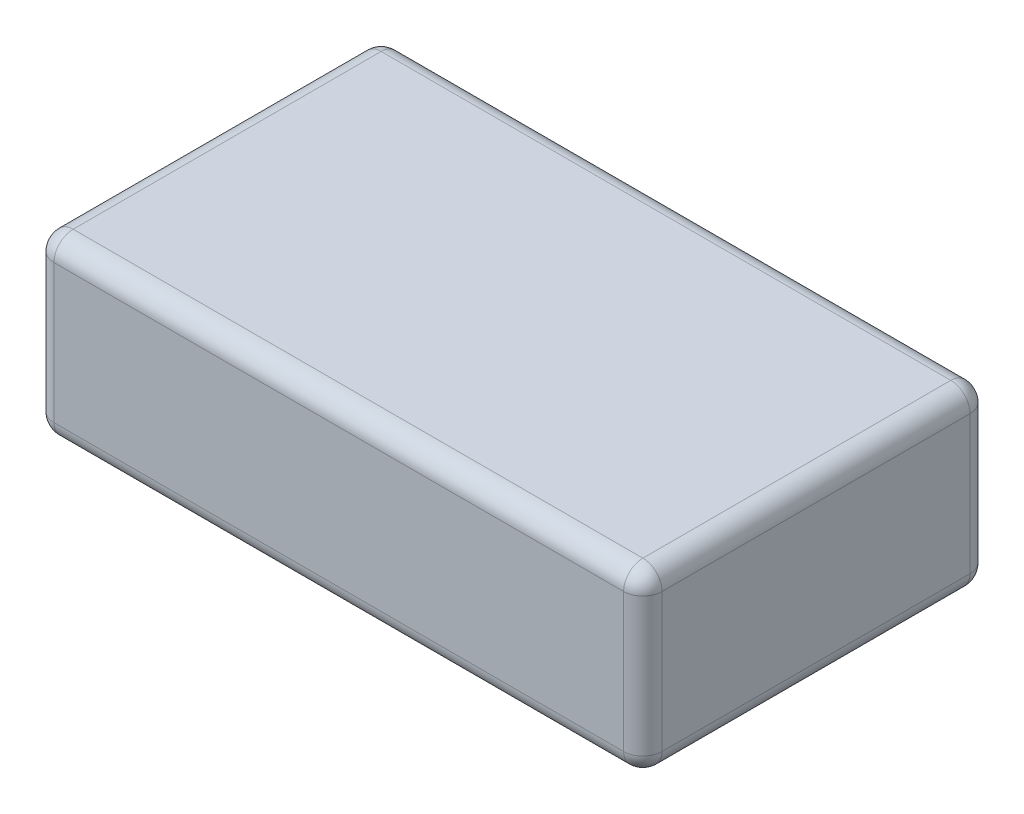
ISO-10303-21;
HEADER;
FILE_DESCRIPTION(('STEP AP214'),'2;1');
FILE_NAME('part.step','',(''),(''),'','','');
FILE_SCHEMA(('AUTOMOTIVE_DESIGN { 1 0 10303 214 1 1 1 1 }'));
ENDSEC;
DATA;
#1=APPLICATION_CONTEXT('core data for automotive mechanical design processes');
#2=APPLICATION_PROTOCOL_DEFINITION('international standard','automotive_design',2000,#1);
#3=PRODUCT_CONTEXT('',#1,'mechanical');
#4=PRODUCT('Part','Part','',(#3));
#5=PRODUCT_RELATED_PRODUCT_CATEGORY('part','',(#4));
#6=PRODUCT_DEFINITION_FORMATION('','',#4);
#7=PRODUCT_DEFINITION_CONTEXT('part definition',#1,'design');
#8=PRODUCT_DEFINITION('design','',#6,#7);
#9=PRODUCT_DEFINITION_SHAPE('','',#8);
#10=(LENGTH_UNIT() NAMED_UNIT(*) SI_UNIT(.MILLI.,.METRE.));
#11=(NAMED_UNIT(*) PLANE_ANGLE_UNIT() SI_UNIT($,.RADIAN.));
#12=(NAMED_UNIT(*) SI_UNIT($,.STERADIAN.) SOLID_ANGLE_UNIT());
#13=UNCERTAINTY_MEASURE_WITH_UNIT(LENGTH_MEASURE(1.E-05),#10,'distance_accuracy_value','');
#14=(GEOMETRIC_REPRESENTATION_CONTEXT(3) GLOBAL_UNCERTAINTY_ASSIGNED_CONTEXT((#13)) GLOBAL_UNIT_ASSIGNED_CONTEXT((#10,
#11,#12)) REPRESENTATION_CONTEXT('',''));
#15=CARTESIAN_POINT('',(0.,0.,0.));
#16=DIRECTION('',(0.,0.,1.));
#17=DIRECTION('',(1.,0.,0.));
#18=AXIS2_PLACEMENT_3D('',#15,#16,#17);
#19=CARTESIAN_POINT('',(0.,46.,0.));
#20=DIRECTION('',(1.,0.,0.));
#21=DIRECTION('',(0.,0.,-1.));
#22=AXIS2_PLACEMENT_3D('',#19,#20,#21);
#23=PLANE('',#22);
#24=DIRECTION('',(0.,-1.,0.));
#25=VECTOR('',#24,1.);
#26=CARTESIAN_POINT('',(0.,46.,-85.));
#27=LINE('',#26,#25);
#28=CARTESIAN_POINT('',(0.,41.,-85.));
#29=VERTEX_POINT('',#28);
#30=CARTESIAN_POINT('',(0.,5.,-85.));
#31=VERTEX_POINT('',#30);
#32=EDGE_CURVE('E184',#29,#31,#27,.T.);
#33=ORIENTED_EDGE('',*,*,#32,.T.);
#34=DIRECTION('',(0.,0.,1.));
#35=VECTOR('',#34,1.);
#36=CARTESIAN_POINT('',(0.,5.,0.));
#37=LINE('',#36,#35);
#38=CARTESIAN_POINT('',(0.,5.,-5.));
#39=VERTEX_POINT('',#38);
#40=EDGE_CURVE('E187',#31,#39,#37,.T.);
#41=ORIENTED_EDGE('',*,*,#40,.T.);
#42=DIRECTION('',(0.,-1.,0.));
#43=VECTOR('',#42,1.);
#44=CARTESIAN_POINT('',(0.,46.,-5.));
#45=LINE('',#44,#43);
#46=CARTESIAN_POINT('',(0.,41.,-5.));
#47=VERTEX_POINT('',#46);
#48=EDGE_CURVE('E182',#39,#47,#45,.F.);
#49=ORIENTED_EDGE('',*,*,#48,.T.);
#50=DIRECTION('',(0.,0.,1.));
#51=VECTOR('',#50,1.);
#52=CARTESIAN_POINT('',(0.,41.,0.));
#53=LINE('',#52,#51);
#54=EDGE_CURVE('E180',#47,#29,#53,.F.);
#55=ORIENTED_EDGE('',*,*,#54,.T.);
#56=EDGE_LOOP('',(#33,#41,#49,#55));
#57=FACE_BOUND('',#56,.T.);
#58=ADVANCED_FACE('F33',(#57),#23,.F.);
#59=CARTESIAN_POINT('',(0.,46.,0.));
#60=DIRECTION('',(0.,0.,-1.));
#61=DIRECTION('',(-1.,0.,0.));
#62=AXIS2_PLACEMENT_3D('',#59,#60,#61);
#63=PLANE('',#62);
#64=DIRECTION('',(0.,-1.,0.));
#65=VECTOR('',#64,1.);
#66=CARTESIAN_POINT('',(5.,46.,0.));
#67=LINE('',#66,#65);
#68=CARTESIAN_POINT('',(5.,41.,0.));
#69=VERTEX_POINT('',#68);
#70=CARTESIAN_POINT('',(5.,5.,0.));
#71=VERTEX_POINT('',#70);
#72=EDGE_CURVE('E166',#69,#71,#67,.T.);
#73=ORIENTED_EDGE('',*,*,#72,.T.);
#74=DIRECTION('',(1.,0.,0.));
#75=VECTOR('',#74,1.);
#76=CARTESIAN_POINT('',(158.,5.,0.));
#77=LINE('',#76,#75);
#78=CARTESIAN_POINT('',(153.,5.,0.));
#79=VERTEX_POINT('',#78);
#80=EDGE_CURVE('E171',#71,#79,#77,.T.);
#81=ORIENTED_EDGE('',*,*,#80,.T.);
#82=DIRECTION('',(0.,-1.,0.));
#83=VECTOR('',#82,1.);
#84=CARTESIAN_POINT('',(153.,46.,0.));
#85=LINE('',#84,#83);
#86=CARTESIAN_POINT('',(153.,41.,0.));
#87=VERTEX_POINT('',#86);
#88=EDGE_CURVE('E168',#79,#87,#85,.F.);
#89=ORIENTED_EDGE('',*,*,#88,.T.);
#90=DIRECTION('',(1.,0.,0.));
#91=VECTOR('',#90,1.);
#92=CARTESIAN_POINT('',(0.,41.,0.));
#93=LINE('',#92,#91);
#94=EDGE_CURVE('E164',#87,#69,#93,.F.);
#95=ORIENTED_EDGE('',*,*,#94,.T.);
#96=EDGE_LOOP('',(#73,#81,#89,#95));
#97=FACE_BOUND('',#96,.T.);
#98=ADVANCED_FACE('F305',(#97),#63,.F.);
#99=CARTESIAN_POINT('',(158.,46.,0.));
#100=DIRECTION('',(-1.,0.,0.));
#101=DIRECTION('',(0.,0.,1.));
#102=AXIS2_PLACEMENT_3D('',#99,#100,#101);
#103=PLANE('',#102);
#104=DIRECTION('',(0.,-1.,0.));
#105=VECTOR('',#104,1.);
#106=CARTESIAN_POINT('',(158.,46.,-5.));
#107=LINE('',#106,#105);
#108=CARTESIAN_POINT('',(158.,41.,-5.));
#109=VERTEX_POINT('',#108);
#110=CARTESIAN_POINT('',(158.,5.,-5.));
#111=VERTEX_POINT('',#110);
#112=EDGE_CURVE('E132',#109,#111,#107,.T.);
#113=ORIENTED_EDGE('',*,*,#112,.T.);
#114=DIRECTION('',(0.,0.,-1.));
#115=VECTOR('',#114,1.);
#116=CARTESIAN_POINT('',(158.,5.,-90.));
#117=LINE('',#116,#115);
#118=CARTESIAN_POINT('',(158.,5.,-85.));
#119=VERTEX_POINT('',#118);
#120=EDGE_CURVE('E128',#111,#119,#117,.T.);
#121=ORIENTED_EDGE('',*,*,#120,.T.);
#122=DIRECTION('',(0.,-1.,0.));
#123=VECTOR('',#122,1.);
#124=CARTESIAN_POINT('',(158.,46.,-85.));
#125=LINE('',#124,#123);
#126=CARTESIAN_POINT('',(158.,41.,-85.));
#127=VERTEX_POINT('',#126);
#128=EDGE_CURVE('E120',#119,#127,#125,.F.);
#129=ORIENTED_EDGE('',*,*,#128,.T.);
#130=DIRECTION('',(0.,0.,-1.));
#131=VECTOR('',#130,1.);
#132=CARTESIAN_POINT('',(158.,41.,0.));
#133=LINE('',#132,#131);
#134=EDGE_CURVE('E125',#127,#109,#133,.F.);
#135=ORIENTED_EDGE('',*,*,#134,.T.);
#136=EDGE_LOOP('',(#113,#121,#129,#135));
#137=FACE_BOUND('',#136,.T.);
#138=ADVANCED_FACE('F123',(#137),#103,.F.);
#139=CARTESIAN_POINT('',(0.,46.,-90.));
#140=DIRECTION('',(0.,0.,1.));
#141=DIRECTION('',(1.,0.,0.));
#142=AXIS2_PLACEMENT_3D('',#139,#140,#141);
#143=PLANE('',#142);
#144=DIRECTION('',(0.,-1.,0.));
#145=VECTOR('',#144,1.);
#146=CARTESIAN_POINT('',(153.,46.,-90.));
#147=LINE('',#146,#145);
#148=CARTESIAN_POINT('',(153.,41.,-90.));
#149=VERTEX_POINT('',#148);
#150=CARTESIAN_POINT('',(153.,5.,-90.));
#151=VERTEX_POINT('',#150);
#152=EDGE_CURVE('E140',#149,#151,#147,.T.);
#153=ORIENTED_EDGE('',*,*,#152,.T.);
#154=DIRECTION('',(-1.,0.,0.));
#155=VECTOR('',#154,1.);
#156=CARTESIAN_POINT('',(0.,5.,-90.));
#157=LINE('',#156,#155);
#158=CARTESIAN_POINT('',(5.,5.,-90.));
#159=VERTEX_POINT('',#158);
#160=EDGE_CURVE('E178',#151,#159,#157,.T.);
#161=ORIENTED_EDGE('',*,*,#160,.T.);
#162=DIRECTION('',(0.,-1.,0.));
#163=VECTOR('',#162,1.);
#164=CARTESIAN_POINT('',(5.,46.,-90.));
#165=LINE('',#164,#163);
#166=CARTESIAN_POINT('',(5.,41.,-90.));
#167=VERTEX_POINT('',#166);
#168=EDGE_CURVE('E175',#159,#167,#165,.F.);
#169=ORIENTED_EDGE('',*,*,#168,.T.);
#170=DIRECTION('',(-1.,0.,0.));
#171=VECTOR('',#170,1.);
#172=CARTESIAN_POINT('',(0.,41.,-90.));
#173=LINE('',#172,#171);
#174=EDGE_CURVE('E173',#167,#149,#173,.F.);
#175=ORIENTED_EDGE('',*,*,#174,.T.);
#176=EDGE_LOOP('',(#153,#161,#169,#175));
#177=FACE_BOUND('',#176,.T.);
#178=ADVANCED_FACE('F296',(#177),#143,.F.);
#179=CARTESIAN_POINT('',(0.,46.,0.));
#180=DIRECTION('',(0.,-1.,0.));
#181=DIRECTION('',(0.,0.,-1.));
#182=AXIS2_PLACEMENT_3D('',#179,#180,#181);
#183=PLANE('',#182);
#184=DIRECTION('',(0.,0.,-1.));
#185=VECTOR('',#184,1.);
#186=CARTESIAN_POINT('',(153.,46.,0.));
#187=LINE('',#186,#185);
#188=CARTESIAN_POINT('',(153.,46.,-5.));
#189=VERTEX_POINT('',#188);
#190=CARTESIAN_POINT('',(153.,46.,-85.));
#191=VERTEX_POINT('',#190);
#192=EDGE_CURVE('E42',#189,#191,#187,.T.);
#193=ORIENTED_EDGE('',*,*,#192,.T.);
#194=DIRECTION('',(-1.,0.,0.));
#195=VECTOR('',#194,1.);
#196=CARTESIAN_POINT('',(0.,46.,-85.));
#197=LINE('',#196,#195);
#198=CARTESIAN_POINT('',(5.,46.,-85.));
#199=VERTEX_POINT('',#198);
#200=EDGE_CURVE('E11',#191,#199,#197,.T.);
#201=ORIENTED_EDGE('',*,*,#200,.T.);
#202=DIRECTION('',(0.,0.,1.));
#203=VECTOR('',#202,1.);
#204=CARTESIAN_POINT('',(5.,46.,0.));
#205=LINE('',#204,#203);
#206=CARTESIAN_POINT('',(5.,46.,-5.));
#207=VERTEX_POINT('',#206);
#208=EDGE_CURVE('E198',#199,#207,#205,.T.);
#209=ORIENTED_EDGE('',*,*,#208,.T.);
#210=DIRECTION('',(1.,0.,0.));
#211=VECTOR('',#210,1.);
#212=CARTESIAN_POINT('',(0.,46.,-5.));
#213=LINE('',#212,#211);
#214=EDGE_CURVE('E53',#207,#189,#213,.T.);
#215=ORIENTED_EDGE('',*,*,#214,.T.);
#216=EDGE_LOOP('',(#193,#201,#209,#215));
#217=FACE_BOUND('',#216,.T.);
#218=ADVANCED_FACE('F298',(#217),#183,.F.);
#219=CARTESIAN_POINT('',(0.,0.,0.));
#220=DIRECTION('',(0.,-1.,0.));
#221=DIRECTION('',(0.,0.,-1.));
#222=AXIS2_PLACEMENT_3D('',#219,#220,#221);
#223=PLANE('',#222);
#224=DIRECTION('',(0.,0.,-1.));
#225=VECTOR('',#224,1.);
#226=CARTESIAN_POINT('',(153.,0.,0.));
#227=LINE('',#226,#225);
#228=CARTESIAN_POINT('',(153.,0.,-85.));
#229=VERTEX_POINT('',#228);
#230=CARTESIAN_POINT('',(153.,0.,-5.));
#231=VERTEX_POINT('',#230);
#232=EDGE_CURVE('E193',#229,#231,#227,.F.);
#233=ORIENTED_EDGE('',*,*,#232,.T.);
#234=DIRECTION('',(1.,0.,0.));
#235=VECTOR('',#234,1.);
#236=CARTESIAN_POINT('',(0.,0.,-5.));
#237=LINE('',#236,#235);
#238=CARTESIAN_POINT('',(5.,0.,-5.));
#239=VERTEX_POINT('',#238);
#240=EDGE_CURVE('E195',#231,#239,#237,.F.);
#241=ORIENTED_EDGE('',*,*,#240,.T.);
#242=DIRECTION('',(0.,0.,1.));
#243=VECTOR('',#242,1.);
#244=CARTESIAN_POINT('',(5.,0.,-90.));
#245=LINE('',#244,#243);
#246=CARTESIAN_POINT('',(5.,0.,-85.));
#247=VERTEX_POINT('',#246);
#248=EDGE_CURVE('E189',#239,#247,#245,.F.);
#249=ORIENTED_EDGE('',*,*,#248,.T.);
#250=DIRECTION('',(-1.,0.,0.));
#251=VECTOR('',#250,1.);
#252=CARTESIAN_POINT('',(158.,0.,-85.));
#253=LINE('',#252,#251);
#254=EDGE_CURVE('E191',#247,#229,#253,.F.);
#255=ORIENTED_EDGE('',*,*,#254,.T.);
#256=EDGE_LOOP('',(#233,#241,#249,#255));
#257=FACE_BOUND('',#256,.T.);
#258=ADVANCED_FACE('F265',(#257),#223,.T.);
#259=CARTESIAN_POINT('',(5.,46.,-85.));
#260=DIRECTION('',(0.,-1.,0.));
#261=DIRECTION('',(0.,0.,-1.));
#262=AXIS2_PLACEMENT_3D('',#259,#260,#261);
#263=CYLINDRICAL_SURFACE('',#262,5.);
#264=CARTESIAN_POINT('',(5.,41.,-85.));
#265=DIRECTION('',(0.,1.,0.));
#266=DIRECTION('',(0.,0.,1.));
#267=AXIS2_PLACEMENT_3D('',#264,#265,#266);
#268=CIRCLE('',#267,5.);
#269=EDGE_CURVE('E37',#167,#29,#268,.T.);
#270=ORIENTED_EDGE('',*,*,#269,.F.);
#271=ORIENTED_EDGE('',*,*,#168,.F.);
#272=CARTESIAN_POINT('',(5.,5.,-85.));
#273=DIRECTION('',(0.,-1.,0.));
#274=DIRECTION('',(0.,0.,-1.));
#275=AXIS2_PLACEMENT_3D('',#272,#273,#274);
#276=CIRCLE('',#275,5.);
#277=EDGE_CURVE('E160',#31,#159,#276,.T.);
#278=ORIENTED_EDGE('',*,*,#277,.F.);
#279=ORIENTED_EDGE('',*,*,#32,.F.);
#280=EDGE_LOOP('',(#270,#271,#278,#279));
#281=FACE_BOUND('',#280,.T.);
#282=ADVANCED_FACE('F35',(#281),#263,.T.);
#283=CARTESIAN_POINT('',(5.,41.,-85.));
#284=DIRECTION('',(0.,0.,1.));
#285=DIRECTION('',(1.,0.,0.));
#286=AXIS2_PLACEMENT_3D('',#283,#284,#285);
#287=SPHERICAL_SURFACE('',#286,5.);
#288=CARTESIAN_POINT('',(5.,41.,-85.));
#289=DIRECTION('',(-1.,0.,0.));
#290=DIRECTION('',(0.,0.,1.));
#291=AXIS2_PLACEMENT_3D('',#288,#289,#290);
#292=CIRCLE('',#291,5.);
#293=EDGE_CURVE('E244',#167,#199,#292,.F.);
#294=ORIENTED_EDGE('',*,*,#293,.F.);
#295=ORIENTED_EDGE('',*,*,#269,.T.);
#296=CARTESIAN_POINT('',(5.,41.,-85.));
#297=DIRECTION('',(0.,0.,-1.));
#298=DIRECTION('',(-1.,0.,0.));
#299=AXIS2_PLACEMENT_3D('',#296,#297,#298);
#300=CIRCLE('',#299,5.);
#301=EDGE_CURVE('E247',#199,#29,#300,.F.);
#302=ORIENTED_EDGE('',*,*,#301,.F.);
#303=EDGE_LOOP('',(#294,#295,#302));
#304=FACE_BOUND('',#303,.T.);
#305=ADVANCED_FACE('F291',(#304),#287,.T.);
#306=CARTESIAN_POINT('',(5.,5.,-85.));
#307=DIRECTION('',(0.,0.,1.));
#308=DIRECTION('',(1.,0.,0.));
#309=AXIS2_PLACEMENT_3D('',#306,#307,#308);
#310=SPHERICAL_SURFACE('',#309,5.);
#311=CARTESIAN_POINT('',(5.,5.,-85.));
#312=DIRECTION('',(0.,0.,-1.));
#313=DIRECTION('',(-1.,0.,0.));
#314=AXIS2_PLACEMENT_3D('',#311,#312,#313);
#315=CIRCLE('',#314,5.);
#316=EDGE_CURVE('E238',#31,#247,#315,.F.);
#317=ORIENTED_EDGE('',*,*,#316,.F.);
#318=ORIENTED_EDGE('',*,*,#277,.T.);
#319=CARTESIAN_POINT('',(5.,5.,-85.));
#320=DIRECTION('',(-1.,0.,0.));
#321=DIRECTION('',(0.,0.,1.));
#322=AXIS2_PLACEMENT_3D('',#319,#320,#321);
#323=CIRCLE('',#322,5.);
#324=EDGE_CURVE('E241',#247,#159,#323,.F.);
#325=ORIENTED_EDGE('',*,*,#324,.F.);
#326=EDGE_LOOP('',(#317,#318,#325));
#327=FACE_BOUND('',#326,.T.);
#328=ADVANCED_FACE('F254',(#327),#310,.T.);
#329=CARTESIAN_POINT('',(5.,41.,0.));
#330=DIRECTION('',(0.,0.,1.));
#331=DIRECTION('',(1.,0.,0.));
#332=AXIS2_PLACEMENT_3D('',#329,#330,#331);
#333=CYLINDRICAL_SURFACE('',#332,5.);
#334=ORIENTED_EDGE('',*,*,#301,.T.);
#335=ORIENTED_EDGE('',*,*,#54,.F.);
#336=CARTESIAN_POINT('',(5.,41.,-5.));
#337=DIRECTION('',(0.,0.,1.));
#338=DIRECTION('',(1.,0.,0.));
#339=AXIS2_PLACEMENT_3D('',#336,#337,#338);
#340=CIRCLE('',#339,5.);
#341=EDGE_CURVE('E232',#207,#47,#340,.T.);
#342=ORIENTED_EDGE('',*,*,#341,.F.);
#343=ORIENTED_EDGE('',*,*,#208,.F.);
#344=EDGE_LOOP('',(#334,#335,#342,#343));
#345=FACE_BOUND('',#344,.T.);
#346=ADVANCED_FACE('F286',(#345),#333,.T.);
#347=CARTESIAN_POINT('',(0.,41.,-85.));
#348=DIRECTION('',(-1.,0.,0.));
#349=DIRECTION('',(0.,0.,1.));
#350=AXIS2_PLACEMENT_3D('',#347,#348,#349);
#351=CYLINDRICAL_SURFACE('',#350,5.);
#352=ORIENTED_EDGE('',*,*,#293,.T.);
#353=ORIENTED_EDGE('',*,*,#200,.F.);
#354=CARTESIAN_POINT('',(153.,41.,-85.));
#355=DIRECTION('',(1.,0.,0.));
#356=DIRECTION('',(0.,0.,-1.));
#357=AXIS2_PLACEMENT_3D('',#354,#355,#356);
#358=CIRCLE('',#357,5.);
#359=EDGE_CURVE('E144',#149,#191,#358,.T.);
#360=ORIENTED_EDGE('',*,*,#359,.F.);
#361=ORIENTED_EDGE('',*,*,#174,.F.);
#362=EDGE_LOOP('',(#352,#353,#360,#361));
#363=FACE_BOUND('',#362,.T.);
#364=ADVANCED_FACE('F294',(#363),#351,.T.);
#365=CARTESIAN_POINT('',(153.,46.,-85.));
#366=DIRECTION('',(0.,-1.,0.));
#367=DIRECTION('',(0.,0.,-1.));
#368=AXIS2_PLACEMENT_3D('',#365,#366,#367);
#369=CYLINDRICAL_SURFACE('',#368,5.);
#370=CARTESIAN_POINT('',(153.,5.,-85.));
#371=DIRECTION('',(0.,-1.,0.));
#372=DIRECTION('',(0.,0.,-1.));
#373=AXIS2_PLACEMENT_3D('',#370,#371,#372);
#374=CIRCLE('',#373,5.);
#375=EDGE_CURVE('E145',#151,#119,#374,.T.);
#376=ORIENTED_EDGE('',*,*,#375,.F.);
#377=ORIENTED_EDGE('',*,*,#152,.F.);
#378=CARTESIAN_POINT('',(153.,41.,-85.));
#379=DIRECTION('',(0.,1.,0.));
#380=DIRECTION('',(0.,0.,1.));
#381=AXIS2_PLACEMENT_3D('',#378,#379,#380);
#382=CIRCLE('',#381,5.);
#383=EDGE_CURVE('E136',#127,#149,#382,.T.);
#384=ORIENTED_EDGE('',*,*,#383,.F.);
#385=ORIENTED_EDGE('',*,*,#128,.F.);
#386=EDGE_LOOP('',(#376,#377,#384,#385));
#387=FACE_BOUND('',#386,.T.);
#388=ADVANCED_FACE('F138',(#387),#369,.T.);
#389=CARTESIAN_POINT('',(0.,5.,-85.));
#390=DIRECTION('',(1.,0.,0.));
#391=DIRECTION('',(0.,0.,-1.));
#392=AXIS2_PLACEMENT_3D('',#389,#390,#391);
#393=CYLINDRICAL_SURFACE('',#392,5.);
#394=ORIENTED_EDGE('',*,*,#324,.T.);
#395=ORIENTED_EDGE('',*,*,#160,.F.);
#396=CARTESIAN_POINT('',(153.,5.,-85.));
#397=DIRECTION('',(1.,0.,0.));
#398=DIRECTION('',(0.,0.,-1.));
#399=AXIS2_PLACEMENT_3D('',#396,#397,#398);
#400=CIRCLE('',#399,5.);
#401=EDGE_CURVE('E228',#229,#151,#400,.T.);
#402=ORIENTED_EDGE('',*,*,#401,.F.);
#403=ORIENTED_EDGE('',*,*,#254,.F.);
#404=EDGE_LOOP('',(#394,#395,#402,#403));
#405=FACE_BOUND('',#404,.T.);
#406=ADVANCED_FACE('F261',(#405),#393,.T.);
#407=CARTESIAN_POINT('',(5.,5.,0.));
#408=DIRECTION('',(0.,0.,-1.));
#409=DIRECTION('',(-1.,0.,0.));
#410=AXIS2_PLACEMENT_3D('',#407,#408,#409);
#411=CYLINDRICAL_SURFACE('',#410,5.);
#412=ORIENTED_EDGE('',*,*,#316,.T.);
#413=ORIENTED_EDGE('',*,*,#248,.F.);
#414=CARTESIAN_POINT('',(5.,5.,-5.));
#415=DIRECTION('',(0.,0.,1.));
#416=DIRECTION('',(1.,0.,0.));
#417=AXIS2_PLACEMENT_3D('',#414,#415,#416);
#418=CIRCLE('',#417,5.);
#419=EDGE_CURVE('E225',#39,#239,#418,.T.);
#420=ORIENTED_EDGE('',*,*,#419,.F.);
#421=ORIENTED_EDGE('',*,*,#40,.F.);
#422=EDGE_LOOP('',(#412,#413,#420,#421));
#423=FACE_BOUND('',#422,.T.);
#424=ADVANCED_FACE('F271',(#423),#411,.T.);
#425=CARTESIAN_POINT('',(5.,46.,-5.));
#426=DIRECTION('',(0.,-1.,0.));
#427=DIRECTION('',(0.,0.,-1.));
#428=AXIS2_PLACEMENT_3D('',#425,#426,#427);
#429=CYLINDRICAL_SURFACE('',#428,5.);
#430=CARTESIAN_POINT('',(5.,41.,-5.));
#431=DIRECTION('',(0.,1.,0.));
#432=DIRECTION('',(0.,0.,1.));
#433=AXIS2_PLACEMENT_3D('',#430,#431,#432);
#434=CIRCLE('',#433,5.);
#435=EDGE_CURVE('E235',#47,#69,#434,.T.);
#436=ORIENTED_EDGE('',*,*,#435,.F.);
#437=ORIENTED_EDGE('',*,*,#48,.F.);
#438=CARTESIAN_POINT('',(5.,5.,-5.));
#439=DIRECTION('',(0.,-1.,0.));
#440=DIRECTION('',(0.,0.,-1.));
#441=AXIS2_PLACEMENT_3D('',#438,#439,#440);
#442=CIRCLE('',#441,5.);
#443=EDGE_CURVE('E222',#71,#39,#442,.T.);
#444=ORIENTED_EDGE('',*,*,#443,.F.);
#445=ORIENTED_EDGE('',*,*,#72,.F.);
#446=EDGE_LOOP('',(#436,#437,#444,#445));
#447=FACE_BOUND('',#446,.T.);
#448=ADVANCED_FACE('F278',(#447),#429,.T.);
#449=CARTESIAN_POINT('',(5.,41.,-5.));
#450=DIRECTION('',(0.,0.,1.));
#451=DIRECTION('',(1.,0.,0.));
#452=AXIS2_PLACEMENT_3D('',#449,#450,#451);
#453=SPHERICAL_SURFACE('',#452,5.);
#454=ORIENTED_EDGE('',*,*,#341,.T.);
#455=ORIENTED_EDGE('',*,*,#435,.T.);
#456=CARTESIAN_POINT('',(5.,41.,-5.));
#457=DIRECTION('',(-1.,0.,0.));
#458=DIRECTION('',(0.,0.,1.));
#459=AXIS2_PLACEMENT_3D('',#456,#457,#458);
#460=CIRCLE('',#459,5.);
#461=EDGE_CURVE('E151',#207,#69,#460,.F.);
#462=ORIENTED_EDGE('',*,*,#461,.F.);
#463=EDGE_LOOP('',(#454,#455,#462));
#464=FACE_BOUND('',#463,.T.);
#465=ADVANCED_FACE('F284',(#464),#453,.T.);
#466=CARTESIAN_POINT('',(153.,41.,-85.));
#467=DIRECTION('',(0.,0.,1.));
#468=DIRECTION('',(1.,0.,0.));
#469=AXIS2_PLACEMENT_3D('',#466,#467,#468);
#470=SPHERICAL_SURFACE('',#469,5.);
#471=ORIENTED_EDGE('',*,*,#383,.T.);
#472=ORIENTED_EDGE('',*,*,#359,.T.);
#473=CARTESIAN_POINT('',(153.,41.,-85.));
#474=DIRECTION('',(0.,0.,-1.));
#475=DIRECTION('',(-1.,0.,0.));
#476=AXIS2_PLACEMENT_3D('',#473,#474,#475);
#477=CIRCLE('',#476,5.);
#478=EDGE_CURVE('E148',#127,#191,#477,.F.);
#479=ORIENTED_EDGE('',*,*,#478,.F.);
#480=EDGE_LOOP('',(#471,#472,#479));
#481=FACE_BOUND('',#480,.T.);
#482=ADVANCED_FACE('F149',(#481),#470,.T.);
#483=CARTESIAN_POINT('',(153.,5.,-85.));
#484=DIRECTION('',(0.,0.,1.));
#485=DIRECTION('',(1.,0.,0.));
#486=AXIS2_PLACEMENT_3D('',#483,#484,#485);
#487=SPHERICAL_SURFACE('',#486,5.);
#488=ORIENTED_EDGE('',*,*,#401,.T.);
#489=ORIENTED_EDGE('',*,*,#375,.T.);
#490=CARTESIAN_POINT('',(153.,5.,-85.));
#491=DIRECTION('',(0.,0.,-1.));
#492=DIRECTION('',(-1.,0.,0.));
#493=AXIS2_PLACEMENT_3D('',#490,#491,#492);
#494=CIRCLE('',#493,5.);
#495=EDGE_CURVE('E152',#229,#119,#494,.F.);
#496=ORIENTED_EDGE('',*,*,#495,.F.);
#497=EDGE_LOOP('',(#488,#489,#496));
#498=FACE_BOUND('',#497,.T.);
#499=ADVANCED_FACE('F345',(#498),#487,.T.);
#500=CARTESIAN_POINT('',(5.,5.,-5.));
#501=DIRECTION('',(0.,0.,1.));
#502=DIRECTION('',(1.,0.,0.));
#503=AXIS2_PLACEMENT_3D('',#500,#501,#502);
#504=SPHERICAL_SURFACE('',#503,5.);
#505=ORIENTED_EDGE('',*,*,#443,.T.);
#506=ORIENTED_EDGE('',*,*,#419,.T.);
#507=CARTESIAN_POINT('',(5.,5.,-5.));
#508=DIRECTION('',(-1.,0.,0.));
#509=DIRECTION('',(0.,0.,1.));
#510=AXIS2_PLACEMENT_3D('',#507,#508,#509);
#511=CIRCLE('',#510,5.);
#512=EDGE_CURVE('E216',#71,#239,#511,.F.);
#513=ORIENTED_EDGE('',*,*,#512,.F.);
#514=EDGE_LOOP('',(#505,#506,#513));
#515=FACE_BOUND('',#514,.T.);
#516=ADVANCED_FACE('F341',(#515),#504,.T.);
#517=CARTESIAN_POINT('',(0.,41.,-5.));
#518=DIRECTION('',(1.,0.,0.));
#519=DIRECTION('',(0.,0.,-1.));
#520=AXIS2_PLACEMENT_3D('',#517,#518,#519);
#521=CYLINDRICAL_SURFACE('',#520,5.);
#522=ORIENTED_EDGE('',*,*,#461,.T.);
#523=ORIENTED_EDGE('',*,*,#94,.F.);
#524=CARTESIAN_POINT('',(153.,41.,-5.));
#525=DIRECTION('',(1.,0.,0.));
#526=DIRECTION('',(0.,0.,-1.));
#527=AXIS2_PLACEMENT_3D('',#524,#525,#526);
#528=CIRCLE('',#527,5.);
#529=EDGE_CURVE('E213',#189,#87,#528,.T.);
#530=ORIENTED_EDGE('',*,*,#529,.F.);
#531=ORIENTED_EDGE('',*,*,#214,.F.);
#532=EDGE_LOOP('',(#522,#523,#530,#531));
#533=FACE_BOUND('',#532,.T.);
#534=ADVANCED_FACE('F338',(#533),#521,.T.);
#535=CARTESIAN_POINT('',(153.,41.,0.));
#536=DIRECTION('',(0.,0.,-1.));
#537=DIRECTION('',(-1.,0.,0.));
#538=AXIS2_PLACEMENT_3D('',#535,#536,#537);
#539=CYLINDRICAL_SURFACE('',#538,5.);
#540=ORIENTED_EDGE('',*,*,#478,.T.);
#541=ORIENTED_EDGE('',*,*,#192,.F.);
#542=CARTESIAN_POINT('',(153.,41.,-5.));
#543=DIRECTION('',(0.,0.,1.));
#544=DIRECTION('',(1.,0.,0.));
#545=AXIS2_PLACEMENT_3D('',#542,#543,#544);
#546=CIRCLE('',#545,5.);
#547=EDGE_CURVE('E156',#109,#189,#546,.T.);
#548=ORIENTED_EDGE('',*,*,#547,.F.);
#549=ORIENTED_EDGE('',*,*,#134,.F.);
#550=EDGE_LOOP('',(#540,#541,#548,#549));
#551=FACE_BOUND('',#550,.T.);
#552=ADVANCED_FACE('F154',(#551),#539,.T.);
#553=CARTESIAN_POINT('',(153.,5.,0.));
#554=DIRECTION('',(0.,0.,1.));
#555=DIRECTION('',(1.,0.,0.));
#556=AXIS2_PLACEMENT_3D('',#553,#554,#555);
#557=CYLINDRICAL_SURFACE('',#556,5.);
#558=ORIENTED_EDGE('',*,*,#495,.T.);
#559=ORIENTED_EDGE('',*,*,#120,.F.);
#560=CARTESIAN_POINT('',(153.,5.,-5.));
#561=DIRECTION('',(0.,0.,1.));
#562=DIRECTION('',(1.,0.,0.));
#563=AXIS2_PLACEMENT_3D('',#560,#561,#562);
#564=CIRCLE('',#563,5.);
#565=EDGE_CURVE('E209',#231,#111,#564,.T.);
#566=ORIENTED_EDGE('',*,*,#565,.F.);
#567=ORIENTED_EDGE('',*,*,#232,.F.);
#568=EDGE_LOOP('',(#558,#559,#566,#567));
#569=FACE_BOUND('',#568,.T.);
#570=ADVANCED_FACE('F331',(#569),#557,.T.);
#571=CARTESIAN_POINT('',(0.,5.,-5.));
#572=DIRECTION('',(-1.,0.,0.));
#573=DIRECTION('',(0.,0.,1.));
#574=AXIS2_PLACEMENT_3D('',#571,#572,#573);
#575=CYLINDRICAL_SURFACE('',#574,5.);
#576=ORIENTED_EDGE('',*,*,#512,.T.);
#577=ORIENTED_EDGE('',*,*,#240,.F.);
#578=CARTESIAN_POINT('',(153.,5.,-5.));
#579=DIRECTION('',(1.,0.,0.));
#580=DIRECTION('',(0.,0.,-1.));
#581=AXIS2_PLACEMENT_3D('',#578,#579,#580);
#582=CIRCLE('',#581,5.);
#583=EDGE_CURVE('E206',#79,#231,#582,.T.);
#584=ORIENTED_EDGE('',*,*,#583,.F.);
#585=ORIENTED_EDGE('',*,*,#80,.F.);
#586=EDGE_LOOP('',(#576,#577,#584,#585));
#587=FACE_BOUND('',#586,.T.);
#588=ADVANCED_FACE('F327',(#587),#575,.T.);
#589=CARTESIAN_POINT('',(153.,41.,-5.));
#590=DIRECTION('',(0.,0.,1.));
#591=DIRECTION('',(1.,0.,0.));
#592=AXIS2_PLACEMENT_3D('',#589,#590,#591);
#593=SPHERICAL_SURFACE('',#592,5.);
#594=ORIENTED_EDGE('',*,*,#547,.T.);
#595=ORIENTED_EDGE('',*,*,#529,.T.);
#596=CARTESIAN_POINT('',(153.,41.,-5.));
#597=DIRECTION('',(0.,1.,0.));
#598=DIRECTION('',(0.,0.,1.));
#599=AXIS2_PLACEMENT_3D('',#596,#597,#598);
#600=CIRCLE('',#599,5.);
#601=EDGE_CURVE('E204',#109,#87,#600,.F.);
#602=ORIENTED_EDGE('',*,*,#601,.F.);
#603=EDGE_LOOP('',(#594,#595,#602));
#604=FACE_BOUND('',#603,.T.);
#605=ADVANCED_FACE('F323',(#604),#593,.T.);
#606=CARTESIAN_POINT('',(153.,5.,-5.));
#607=DIRECTION('',(0.,0.,1.));
#608=DIRECTION('',(1.,0.,0.));
#609=AXIS2_PLACEMENT_3D('',#606,#607,#608);
#610=SPHERICAL_SURFACE('',#609,5.);
#611=ORIENTED_EDGE('',*,*,#583,.T.);
#612=ORIENTED_EDGE('',*,*,#565,.T.);
#613=CARTESIAN_POINT('',(153.,5.,-5.));
#614=DIRECTION('',(0.,-1.,0.));
#615=DIRECTION('',(0.,0.,-1.));
#616=AXIS2_PLACEMENT_3D('',#613,#614,#615);
#617=CIRCLE('',#616,5.);
#618=EDGE_CURVE('E202',#79,#111,#617,.F.);
#619=ORIENTED_EDGE('',*,*,#618,.F.);
#620=EDGE_LOOP('',(#611,#612,#619));
#621=FACE_BOUND('',#620,.T.);
#622=ADVANCED_FACE('F319',(#621),#610,.T.);
#623=CARTESIAN_POINT('',(153.,46.,-5.));
#624=DIRECTION('',(0.,-1.,0.));
#625=DIRECTION('',(0.,0.,-1.));
#626=AXIS2_PLACEMENT_3D('',#623,#624,#625);
#627=CYLINDRICAL_SURFACE('',#626,5.);
#628=ORIENTED_EDGE('',*,*,#601,.T.);
#629=ORIENTED_EDGE('',*,*,#88,.F.);
#630=ORIENTED_EDGE('',*,*,#618,.T.);
#631=ORIENTED_EDGE('',*,*,#112,.F.);
#632=EDGE_LOOP('',(#628,#629,#630,#631));
#633=FACE_BOUND('',#632,.T.);
#634=ADVANCED_FACE('F316',(#633),#627,.T.);
#635=CLOSED_SHELL('',(#58,#98,#138,#178,#218,#258,#282,#305,#328,#346,#364,#388,#406,#424,#448,
#465,#482,#499,#516,#534,#552,#570,#588,#605,#622,#634));
#636=MANIFOLD_SOLID_BREP('B2',#635);
#637=ADVANCED_BREP_SHAPE_REPRESENTATION('',(#18,#636),#14);
#638=SHAPE_DEFINITION_REPRESENTATION(#9,#637);
ENDSEC;
END-ISO-10303-21;
